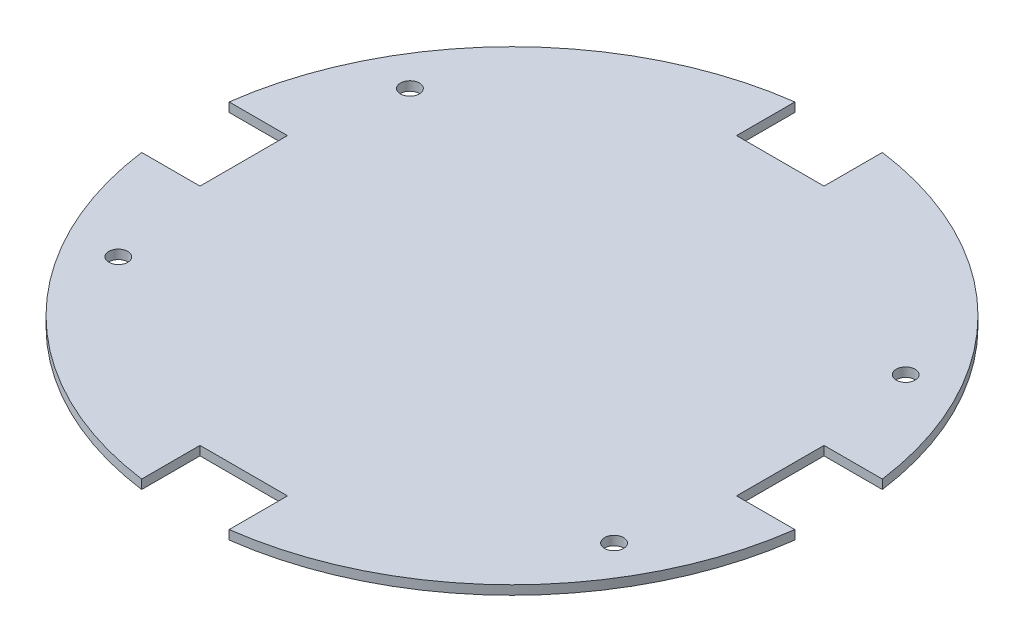
ISO-10303-21;
HEADER;
FILE_DESCRIPTION(('STEP AP214'),'2;1');
FILE_NAME('part.step','',(''),(''),'','','');
FILE_SCHEMA(('AUTOMOTIVE_DESIGN { 1 0 10303 214 1 1 1 1 }'));
ENDSEC;
DATA;
#1=APPLICATION_CONTEXT('core data for automotive mechanical design processes');
#2=APPLICATION_PROTOCOL_DEFINITION('international standard','automotive_design',2000,#1);
#3=PRODUCT_CONTEXT('',#1,'mechanical');
#4=PRODUCT('Part','Part','',(#3));
#5=PRODUCT_RELATED_PRODUCT_CATEGORY('part','',(#4));
#6=PRODUCT_DEFINITION_FORMATION('','',#4);
#7=PRODUCT_DEFINITION_CONTEXT('part definition',#1,'design');
#8=PRODUCT_DEFINITION('design','',#6,#7);
#9=PRODUCT_DEFINITION_SHAPE('','',#8);
#10=(LENGTH_UNIT() NAMED_UNIT(*) SI_UNIT(.MILLI.,.METRE.));
#11=(NAMED_UNIT(*) PLANE_ANGLE_UNIT() SI_UNIT($,.RADIAN.));
#12=(NAMED_UNIT(*) SI_UNIT($,.STERADIAN.) SOLID_ANGLE_UNIT());
#13=UNCERTAINTY_MEASURE_WITH_UNIT(LENGTH_MEASURE(1.E-05),#10,'distance_accuracy_value','');
#14=(GEOMETRIC_REPRESENTATION_CONTEXT(3) GLOBAL_UNCERTAINTY_ASSIGNED_CONTEXT((#13)) GLOBAL_UNIT_ASSIGNED_CONTEXT((#10,
#11,#12)) REPRESENTATION_CONTEXT('',''));
#15=CARTESIAN_POINT('',(0.,0.,0.));
#16=DIRECTION('',(0.,0.,1.));
#17=DIRECTION('',(1.,0.,0.));
#18=AXIS2_PLACEMENT_3D('',#15,#16,#17);
#19=CARTESIAN_POINT('',(0.,1.5875,0.));
#20=DIRECTION('',(0.,1.,0.));
#21=DIRECTION('',(0.,0.,1.));
#22=AXIS2_PLACEMENT_3D('',#19,#20,#21);
#23=PLANE('',#22);
#24=CARTESIAN_POINT('',(43.18,1.5875,25.4));
#25=DIRECTION('',(0.,1.,0.));
#26=DIRECTION('',(0.,0.,1.));
#27=AXIS2_PLACEMENT_3D('',#24,#25,#26);
#28=CIRCLE('',#27,1.651);
#29=CARTESIAN_POINT('',(43.18,1.5875,27.051));
#30=VERTEX_POINT('',#29);
#31=EDGE_CURVE('E343',#30,#30,#28,.T.);
#32=ORIENTED_EDGE('',*,*,#31,.F.);
#33=EDGE_LOOP('',(#32));
#34=FACE_BOUND('',#33,.T.);
#35=CARTESIAN_POINT('',(-43.18,1.5875,-25.4));
#36=DIRECTION('',(0.,1.,0.));
#37=DIRECTION('',(0.,0.,1.));
#38=AXIS2_PLACEMENT_3D('',#35,#36,#37);
#39=CIRCLE('',#38,1.65099999999999);
#40=CARTESIAN_POINT('',(-43.18,1.5875,-23.749));
#41=VERTEX_POINT('',#40);
#42=EDGE_CURVE('E182',#41,#41,#39,.T.);
#43=ORIENTED_EDGE('',*,*,#42,.F.);
#44=EDGE_LOOP('',(#43));
#45=FACE_BOUND('',#44,.T.);
#46=CARTESIAN_POINT('',(0.,1.5875,0.));
#47=DIRECTION('',(0.,1.,0.));
#48=DIRECTION('',(0.,0.,1.));
#49=AXIS2_PLACEMENT_3D('',#46,#47,#48);
#50=CIRCLE('',#49,57.404);
#51=CARTESIAN_POINT('',(-7.62,1.5875,-56.896));
#52=VERTEX_POINT('',#51);
#53=CARTESIAN_POINT('',(-56.896,1.5875,-7.62));
#54=VERTEX_POINT('',#53);
#55=EDGE_CURVE('E209',#52,#54,#50,.T.);
#56=ORIENTED_EDGE('',*,*,#55,.T.);
#57=DIRECTION('',(1.,0.,0.));
#58=VECTOR('',#57,1.);
#59=CARTESIAN_POINT('',(-56.896,1.5875,-7.62));
#60=LINE('',#59,#58);
#61=CARTESIAN_POINT('',(-46.736,1.5875,-7.62));
#62=VERTEX_POINT('',#61);
#63=EDGE_CURVE('E117',#54,#62,#60,.T.);
#64=ORIENTED_EDGE('',*,*,#63,.T.);
#65=DIRECTION('',(0.,0.,1.));
#66=VECTOR('',#65,1.);
#67=CARTESIAN_POINT('',(-46.736,1.5875,-7.62));
#68=LINE('',#67,#66);
#69=CARTESIAN_POINT('',(-46.736,1.5875,7.62));
#70=VERTEX_POINT('',#69);
#71=EDGE_CURVE('E248',#62,#70,#68,.T.);
#72=ORIENTED_EDGE('',*,*,#71,.T.);
#73=DIRECTION('',(-1.,0.,0.));
#74=VECTOR('',#73,1.);
#75=CARTESIAN_POINT('',(-46.736,1.5875,7.62));
#76=LINE('',#75,#74);
#77=CARTESIAN_POINT('',(-56.896,1.5875,7.61999999999998));
#78=VERTEX_POINT('',#77);
#79=EDGE_CURVE('E267',#70,#78,#76,.T.);
#80=ORIENTED_EDGE('',*,*,#79,.T.);
#81=CARTESIAN_POINT('',(0.,1.5875,0.));
#82=DIRECTION('',(0.,1.,0.));
#83=DIRECTION('',(0.,0.,1.));
#84=AXIS2_PLACEMENT_3D('',#81,#82,#83);
#85=CIRCLE('',#84,57.404);
#86=CARTESIAN_POINT('',(-7.62,1.5875,56.896));
#87=VERTEX_POINT('',#86);
#88=EDGE_CURVE('E264',#78,#87,#85,.T.);
#89=ORIENTED_EDGE('',*,*,#88,.T.);
#90=DIRECTION('',(0.,0.,-1.));
#91=VECTOR('',#90,1.);
#92=CARTESIAN_POINT('',(-7.62,1.5875,56.896));
#93=LINE('',#92,#91);
#94=CARTESIAN_POINT('',(-7.62,1.5875,46.736));
#95=VERTEX_POINT('',#94);
#96=EDGE_CURVE('E266',#87,#95,#93,.T.);
#97=ORIENTED_EDGE('',*,*,#96,.T.);
#98=DIRECTION('',(1.,0.,0.));
#99=VECTOR('',#98,1.);
#100=CARTESIAN_POINT('',(-7.62,1.5875,46.736));
#101=LINE('',#100,#99);
#102=CARTESIAN_POINT('',(7.62,1.5875,46.736));
#103=VERTEX_POINT('',#102);
#104=EDGE_CURVE('E269',#95,#103,#101,.T.);
#105=ORIENTED_EDGE('',*,*,#104,.T.);
#106=DIRECTION('',(0.,0.,1.));
#107=VECTOR('',#106,1.);
#108=CARTESIAN_POINT('',(7.62,1.5875,46.736));
#109=LINE('',#108,#107);
#110=CARTESIAN_POINT('',(7.62,1.5875,56.896));
#111=VERTEX_POINT('',#110);
#112=EDGE_CURVE('E275',#103,#111,#109,.T.);
#113=ORIENTED_EDGE('',*,*,#112,.T.);
#114=CARTESIAN_POINT('',(0.,1.5875,0.));
#115=DIRECTION('',(0.,1.,0.));
#116=DIRECTION('',(0.,0.,1.));
#117=AXIS2_PLACEMENT_3D('',#114,#115,#116);
#118=CIRCLE('',#117,57.404);
#119=CARTESIAN_POINT('',(56.896,1.5875,7.62));
#120=VERTEX_POINT('',#119);
#121=EDGE_CURVE('E277',#111,#120,#118,.T.);
#122=ORIENTED_EDGE('',*,*,#121,.T.);
#123=DIRECTION('',(-1.,0.,0.));
#124=VECTOR('',#123,1.);
#125=CARTESIAN_POINT('',(46.736,1.5875,7.62));
#126=LINE('',#125,#124);
#127=CARTESIAN_POINT('',(46.736,1.5875,7.62));
#128=VERTEX_POINT('',#127);
#129=EDGE_CURVE('E279',#120,#128,#126,.T.);
#130=ORIENTED_EDGE('',*,*,#129,.T.);
#131=DIRECTION('',(0.,0.,-1.));
#132=VECTOR('',#131,1.);
#133=CARTESIAN_POINT('',(46.736,1.5875,-7.62));
#134=LINE('',#133,#132);
#135=CARTESIAN_POINT('',(46.736,1.5875,-7.62));
#136=VERTEX_POINT('',#135);
#137=EDGE_CURVE('E281',#128,#136,#134,.T.);
#138=ORIENTED_EDGE('',*,*,#137,.T.);
#139=DIRECTION('',(1.,0.,0.));
#140=VECTOR('',#139,1.);
#141=CARTESIAN_POINT('',(56.896,1.5875,-7.62));
#142=LINE('',#141,#140);
#143=CARTESIAN_POINT('',(56.896,1.5875,-7.62));
#144=VERTEX_POINT('',#143);
#145=EDGE_CURVE('E283',#136,#144,#142,.T.);
#146=ORIENTED_EDGE('',*,*,#145,.T.);
#147=CARTESIAN_POINT('',(0.,1.5875,0.));
#148=DIRECTION('',(0.,1.,0.));
#149=DIRECTION('',(0.,0.,1.));
#150=AXIS2_PLACEMENT_3D('',#147,#148,#149);
#151=CIRCLE('',#150,57.404);
#152=CARTESIAN_POINT('',(7.62,1.5875,-56.896));
#153=VERTEX_POINT('',#152);
#154=EDGE_CURVE('E160',#144,#153,#151,.T.);
#155=ORIENTED_EDGE('',*,*,#154,.T.);
#156=DIRECTION('',(0.,0.,1.));
#157=VECTOR('',#156,1.);
#158=CARTESIAN_POINT('',(7.62,1.5875,-46.736));
#159=LINE('',#158,#157);
#160=CARTESIAN_POINT('',(7.62,1.5875,-46.736));
#161=VERTEX_POINT('',#160);
#162=EDGE_CURVE('E154',#153,#161,#159,.T.);
#163=ORIENTED_EDGE('',*,*,#162,.T.);
#164=DIRECTION('',(-1.,0.,0.));
#165=VECTOR('',#164,1.);
#166=CARTESIAN_POINT('',(-7.62,1.5875,-46.736));
#167=LINE('',#166,#165);
#168=CARTESIAN_POINT('',(-7.62,1.5875,-46.736));
#169=VERTEX_POINT('',#168);
#170=EDGE_CURVE('E158',#161,#169,#167,.T.);
#171=ORIENTED_EDGE('',*,*,#170,.T.);
#172=DIRECTION('',(0.,0.,-1.));
#173=VECTOR('',#172,1.);
#174=CARTESIAN_POINT('',(-7.62,1.5875,-56.896));
#175=LINE('',#174,#173);
#176=EDGE_CURVE('E50',#169,#52,#175,.T.);
#177=ORIENTED_EDGE('',*,*,#176,.T.);
#178=EDGE_LOOP('',(#56,#64,#72,#80,#89,#97,#105,#113,#122,#130,#138,#146,#155,#163,#171,#177));
#179=FACE_BOUND('',#178,.T.);
#180=CARTESIAN_POINT('',(-43.18,1.5875,25.4));
#181=DIRECTION('',(0.,1.,0.));
#182=DIRECTION('',(0.,0.,1.));
#183=AXIS2_PLACEMENT_3D('',#180,#181,#182);
#184=CIRCLE('',#183,1.651);
#185=CARTESIAN_POINT('',(-43.18,1.5875,27.051));
#186=VERTEX_POINT('',#185);
#187=EDGE_CURVE('E349',#186,#186,#184,.T.);
#188=ORIENTED_EDGE('',*,*,#187,.F.);
#189=EDGE_LOOP('',(#188));
#190=FACE_BOUND('',#189,.T.);
#191=CARTESIAN_POINT('',(43.18,1.5875,-25.4));
#192=DIRECTION('',(0.,1.,0.));
#193=DIRECTION('',(0.,0.,1.));
#194=AXIS2_PLACEMENT_3D('',#191,#192,#193);
#195=CIRCLE('',#194,1.651);
#196=CARTESIAN_POINT('',(43.18,1.5875,-23.749));
#197=VERTEX_POINT('',#196);
#198=EDGE_CURVE('E334',#197,#197,#195,.T.);
#199=ORIENTED_EDGE('',*,*,#198,.F.);
#200=EDGE_LOOP('',(#199));
#201=FACE_BOUND('',#200,.T.);
#202=ADVANCED_FACE('F33',(#34,#45,#179,#190,#201),#23,.T.);
#203=CARTESIAN_POINT('',(0.,0.,0.));
#204=DIRECTION('',(0.,1.,0.));
#205=DIRECTION('',(0.,0.,1.));
#206=AXIS2_PLACEMENT_3D('',#203,#204,#205);
#207=PLANE('',#206);
#208=CARTESIAN_POINT('',(0.,0.,0.));
#209=DIRECTION('',(0.,1.,0.));
#210=DIRECTION('',(0.,0.,1.));
#211=AXIS2_PLACEMENT_3D('',#208,#209,#210);
#212=CIRCLE('',#211,57.404);
#213=CARTESIAN_POINT('',(-7.62,0.,-56.896));
#214=VERTEX_POINT('',#213);
#215=CARTESIAN_POINT('',(-56.896,0.,-7.62));
#216=VERTEX_POINT('',#215);
#217=EDGE_CURVE('E178',#214,#216,#212,.T.);
#218=ORIENTED_EDGE('',*,*,#217,.F.);
#219=DIRECTION('',(0.,0.,-1.));
#220=VECTOR('',#219,1.);
#221=CARTESIAN_POINT('',(-7.62,0.,-56.896));
#222=LINE('',#221,#220);
#223=CARTESIAN_POINT('',(-7.62,0.,-46.736));
#224=VERTEX_POINT('',#223);
#225=EDGE_CURVE('E109',#224,#214,#222,.T.);
#226=ORIENTED_EDGE('',*,*,#225,.F.);
#227=DIRECTION('',(-1.,0.,0.));
#228=VECTOR('',#227,1.);
#229=CARTESIAN_POINT('',(-7.62,0.,-46.736));
#230=LINE('',#229,#228);
#231=CARTESIAN_POINT('',(7.62,0.,-46.736));
#232=VERTEX_POINT('',#231);
#233=EDGE_CURVE('E103',#232,#224,#230,.T.);
#234=ORIENTED_EDGE('',*,*,#233,.F.);
#235=DIRECTION('',(0.,0.,1.));
#236=VECTOR('',#235,1.);
#237=CARTESIAN_POINT('',(7.62,0.,-46.736));
#238=LINE('',#237,#236);
#239=CARTESIAN_POINT('',(7.62,0.,-56.896));
#240=VERTEX_POINT('',#239);
#241=EDGE_CURVE('E168',#240,#232,#238,.T.);
#242=ORIENTED_EDGE('',*,*,#241,.F.);
#243=CARTESIAN_POINT('',(0.,0.,0.));
#244=DIRECTION('',(0.,1.,0.));
#245=DIRECTION('',(0.,0.,1.));
#246=AXIS2_PLACEMENT_3D('',#243,#244,#245);
#247=CIRCLE('',#246,57.404);
#248=CARTESIAN_POINT('',(56.896,0.,-7.62));
#249=VERTEX_POINT('',#248);
#250=EDGE_CURVE('E204',#249,#240,#247,.T.);
#251=ORIENTED_EDGE('',*,*,#250,.F.);
#252=DIRECTION('',(1.,0.,0.));
#253=VECTOR('',#252,1.);
#254=CARTESIAN_POINT('',(56.896,0.,-7.62));
#255=LINE('',#254,#253);
#256=CARTESIAN_POINT('',(46.736,0.,-7.62));
#257=VERTEX_POINT('',#256);
#258=EDGE_CURVE('E202',#257,#249,#255,.T.);
#259=ORIENTED_EDGE('',*,*,#258,.F.);
#260=DIRECTION('',(0.,0.,-1.));
#261=VECTOR('',#260,1.);
#262=CARTESIAN_POINT('',(46.736,0.,-7.62));
#263=LINE('',#262,#261);
#264=CARTESIAN_POINT('',(46.736,0.,7.62));
#265=VERTEX_POINT('',#264);
#266=EDGE_CURVE('E200',#265,#257,#263,.T.);
#267=ORIENTED_EDGE('',*,*,#266,.F.);
#268=DIRECTION('',(-1.,0.,0.));
#269=VECTOR('',#268,1.);
#270=CARTESIAN_POINT('',(46.736,0.,7.62));
#271=LINE('',#270,#269);
#272=CARTESIAN_POINT('',(56.896,0.,7.62));
#273=VERTEX_POINT('',#272);
#274=EDGE_CURVE('E198',#273,#265,#271,.T.);
#275=ORIENTED_EDGE('',*,*,#274,.F.);
#276=CARTESIAN_POINT('',(0.,0.,0.));
#277=DIRECTION('',(0.,1.,0.));
#278=DIRECTION('',(0.,0.,1.));
#279=AXIS2_PLACEMENT_3D('',#276,#277,#278);
#280=CIRCLE('',#279,57.404);
#281=CARTESIAN_POINT('',(7.62,0.,56.896));
#282=VERTEX_POINT('',#281);
#283=EDGE_CURVE('E196',#282,#273,#280,.T.);
#284=ORIENTED_EDGE('',*,*,#283,.F.);
#285=DIRECTION('',(0.,0.,1.));
#286=VECTOR('',#285,1.);
#287=CARTESIAN_POINT('',(7.62,0.,46.736));
#288=LINE('',#287,#286);
#289=CARTESIAN_POINT('',(7.62,0.,46.736));
#290=VERTEX_POINT('',#289);
#291=EDGE_CURVE('E194',#290,#282,#288,.T.);
#292=ORIENTED_EDGE('',*,*,#291,.F.);
#293=DIRECTION('',(1.,0.,0.));
#294=VECTOR('',#293,1.);
#295=CARTESIAN_POINT('',(-7.62,0.,46.736));
#296=LINE('',#295,#294);
#297=CARTESIAN_POINT('',(-7.62,0.,46.736));
#298=VERTEX_POINT('',#297);
#299=EDGE_CURVE('E192',#298,#290,#296,.T.);
#300=ORIENTED_EDGE('',*,*,#299,.F.);
#301=DIRECTION('',(0.,0.,-1.));
#302=VECTOR('',#301,1.);
#303=CARTESIAN_POINT('',(-7.62,0.,56.896));
#304=LINE('',#303,#302);
#305=CARTESIAN_POINT('',(-7.62,0.,56.896));
#306=VERTEX_POINT('',#305);
#307=EDGE_CURVE('E190',#306,#298,#304,.T.);
#308=ORIENTED_EDGE('',*,*,#307,.F.);
#309=CARTESIAN_POINT('',(0.,0.,0.));
#310=DIRECTION('',(0.,1.,0.));
#311=DIRECTION('',(0.,0.,1.));
#312=AXIS2_PLACEMENT_3D('',#309,#310,#311);
#313=CIRCLE('',#312,57.404);
#314=CARTESIAN_POINT('',(-56.896,0.,7.61999999999998));
#315=VERTEX_POINT('',#314);
#316=EDGE_CURVE('E188',#315,#306,#313,.T.);
#317=ORIENTED_EDGE('',*,*,#316,.F.);
#318=DIRECTION('',(-1.,0.,0.));
#319=VECTOR('',#318,1.);
#320=CARTESIAN_POINT('',(-46.736,0.,7.62));
#321=LINE('',#320,#319);
#322=CARTESIAN_POINT('',(-46.736,0.,7.62));
#323=VERTEX_POINT('',#322);
#324=EDGE_CURVE('E186',#323,#315,#321,.T.);
#325=ORIENTED_EDGE('',*,*,#324,.F.);
#326=DIRECTION('',(0.,0.,1.));
#327=VECTOR('',#326,1.);
#328=CARTESIAN_POINT('',(-46.736,0.,-7.62));
#329=LINE('',#328,#327);
#330=CARTESIAN_POINT('',(-46.736,0.,-7.62));
#331=VERTEX_POINT('',#330);
#332=EDGE_CURVE('E184',#331,#323,#329,.T.);
#333=ORIENTED_EDGE('',*,*,#332,.F.);
#334=DIRECTION('',(1.,0.,0.));
#335=VECTOR('',#334,1.);
#336=CARTESIAN_POINT('',(-56.896,0.,-7.62));
#337=LINE('',#336,#335);
#338=EDGE_CURVE('E181',#216,#331,#337,.T.);
#339=ORIENTED_EDGE('',*,*,#338,.F.);
#340=EDGE_LOOP('',(#218,#226,#234,#242,#251,#259,#267,#275,#284,#292,#300,#308,#317,#325,#333,#339));
#341=FACE_BOUND('',#340,.T.);
#342=CARTESIAN_POINT('',(-43.18,0.,-25.4));
#343=DIRECTION('',(0.,1.,0.));
#344=DIRECTION('',(0.,0.,1.));
#345=AXIS2_PLACEMENT_3D('',#342,#343,#344);
#346=CIRCLE('',#345,1.65099999999999);
#347=CARTESIAN_POINT('',(-43.18,0.,-23.749));
#348=VERTEX_POINT('',#347);
#349=EDGE_CURVE('E352',#348,#348,#346,.T.);
#350=ORIENTED_EDGE('',*,*,#349,.T.);
#351=EDGE_LOOP('',(#350));
#352=FACE_BOUND('',#351,.T.);
#353=CARTESIAN_POINT('',(-43.18,0.,25.4));
#354=DIRECTION('',(0.,1.,0.));
#355=DIRECTION('',(0.,0.,1.));
#356=AXIS2_PLACEMENT_3D('',#353,#354,#355);
#357=CIRCLE('',#356,1.651);
#358=CARTESIAN_POINT('',(-43.18,0.,27.051));
#359=VERTEX_POINT('',#358);
#360=EDGE_CURVE('E346',#359,#359,#357,.T.);
#361=ORIENTED_EDGE('',*,*,#360,.T.);
#362=EDGE_LOOP('',(#361));
#363=FACE_BOUND('',#362,.T.);
#364=CARTESIAN_POINT('',(43.18,0.,25.4));
#365=DIRECTION('',(0.,1.,0.));
#366=DIRECTION('',(0.,0.,1.));
#367=AXIS2_PLACEMENT_3D('',#364,#365,#366);
#368=CIRCLE('',#367,1.651);
#369=CARTESIAN_POINT('',(43.18,0.,27.051));
#370=VERTEX_POINT('',#369);
#371=EDGE_CURVE('E340',#370,#370,#368,.T.);
#372=ORIENTED_EDGE('',*,*,#371,.T.);
#373=EDGE_LOOP('',(#372));
#374=FACE_BOUND('',#373,.T.);
#375=CARTESIAN_POINT('',(43.18,0.,-25.4));
#376=DIRECTION('',(0.,1.,0.));
#377=DIRECTION('',(0.,0.,1.));
#378=AXIS2_PLACEMENT_3D('',#375,#376,#377);
#379=CIRCLE('',#378,1.651);
#380=CARTESIAN_POINT('',(43.18,0.,-23.749));
#381=VERTEX_POINT('',#380);
#382=EDGE_CURVE('E337',#381,#381,#379,.T.);
#383=ORIENTED_EDGE('',*,*,#382,.T.);
#384=EDGE_LOOP('',(#383));
#385=FACE_BOUND('',#384,.T.);
#386=ADVANCED_FACE('F252',(#341,#352,#363,#374,#385),#207,.F.);
#387=CARTESIAN_POINT('',(0.,1.5875,0.));
#388=DIRECTION('',(0.,-1.,0.));
#389=DIRECTION('',(0.,0.,-1.));
#390=AXIS2_PLACEMENT_3D('',#387,#388,#389);
#391=CYLINDRICAL_SURFACE('',#390,57.404);
#392=ORIENTED_EDGE('',*,*,#217,.T.);
#393=DIRECTION('',(0.,-1.,0.));
#394=VECTOR('',#393,1.);
#395=CARTESIAN_POINT('',(-56.896,1.5875,-7.62));
#396=LINE('',#395,#394);
#397=EDGE_CURVE('E11',#54,#216,#396,.T.);
#398=ORIENTED_EDGE('',*,*,#397,.F.);
#399=ORIENTED_EDGE('',*,*,#55,.F.);
#400=DIRECTION('',(0.,-1.,0.));
#401=VECTOR('',#400,1.);
#402=CARTESIAN_POINT('',(-7.62,1.5875,-56.896));
#403=LINE('',#402,#401);
#404=EDGE_CURVE('E174',#52,#214,#403,.T.);
#405=ORIENTED_EDGE('',*,*,#404,.T.);
#406=EDGE_LOOP('',(#392,#398,#399,#405));
#407=FACE_BOUND('',#406,.T.);
#408=ADVANCED_FACE('F35',(#407),#391,.T.);
#409=CARTESIAN_POINT('',(-56.896,1.5875,-7.62));
#410=DIRECTION('',(0.,0.,-1.));
#411=DIRECTION('',(-1.,0.,0.));
#412=AXIS2_PLACEMENT_3D('',#409,#410,#411);
#413=PLANE('',#412);
#414=ORIENTED_EDGE('',*,*,#338,.T.);
#415=DIRECTION('',(0.,-1.,0.));
#416=VECTOR('',#415,1.);
#417=CARTESIAN_POINT('',(-46.736,1.5875,-7.62));
#418=LINE('',#417,#416);
#419=EDGE_CURVE('E42',#62,#331,#418,.T.);
#420=ORIENTED_EDGE('',*,*,#419,.F.);
#421=ORIENTED_EDGE('',*,*,#63,.F.);
#422=ORIENTED_EDGE('',*,*,#397,.T.);
#423=EDGE_LOOP('',(#414,#420,#421,#422));
#424=FACE_BOUND('',#423,.T.);
#425=ADVANCED_FACE('F502',(#424),#413,.F.);
#426=CARTESIAN_POINT('',(-46.736,1.5875,-7.62));
#427=DIRECTION('',(1.,0.,0.));
#428=DIRECTION('',(0.,0.,-1.));
#429=AXIS2_PLACEMENT_3D('',#426,#427,#428);
#430=PLANE('',#429);
#431=ORIENTED_EDGE('',*,*,#332,.T.);
#432=DIRECTION('',(0.,-1.,0.));
#433=VECTOR('',#432,1.);
#434=CARTESIAN_POINT('',(-46.736,1.5875,7.62));
#435=LINE('',#434,#433);
#436=EDGE_CURVE('E240',#70,#323,#435,.T.);
#437=ORIENTED_EDGE('',*,*,#436,.F.);
#438=ORIENTED_EDGE('',*,*,#71,.F.);
#439=ORIENTED_EDGE('',*,*,#419,.T.);
#440=EDGE_LOOP('',(#431,#437,#438,#439));
#441=FACE_BOUND('',#440,.T.);
#442=ADVANCED_FACE('F246',(#441),#430,.F.);
#443=CARTESIAN_POINT('',(-46.736,1.5875,7.62));
#444=DIRECTION('',(0.,0.,1.));
#445=DIRECTION('',(1.,0.,0.));
#446=AXIS2_PLACEMENT_3D('',#443,#444,#445);
#447=PLANE('',#446);
#448=ORIENTED_EDGE('',*,*,#324,.T.);
#449=DIRECTION('',(0.,-1.,0.));
#450=VECTOR('',#449,1.);
#451=CARTESIAN_POINT('',(-56.896,1.5875,7.61999999999998));
#452=LINE('',#451,#450);
#453=EDGE_CURVE('E237',#78,#315,#452,.T.);
#454=ORIENTED_EDGE('',*,*,#453,.F.);
#455=ORIENTED_EDGE('',*,*,#79,.F.);
#456=ORIENTED_EDGE('',*,*,#436,.T.);
#457=EDGE_LOOP('',(#448,#454,#455,#456));
#458=FACE_BOUND('',#457,.T.);
#459=ADVANCED_FACE('F258',(#458),#447,.F.);
#460=CARTESIAN_POINT('',(0.,1.5875,0.));
#461=DIRECTION('',(0.,-1.,0.));
#462=DIRECTION('',(0.,0.,-1.));
#463=AXIS2_PLACEMENT_3D('',#460,#461,#462);
#464=CYLINDRICAL_SURFACE('',#463,57.404);
#465=ORIENTED_EDGE('',*,*,#316,.T.);
#466=DIRECTION('',(0.,-1.,0.));
#467=VECTOR('',#466,1.);
#468=CARTESIAN_POINT('',(-7.62,1.5875,56.896));
#469=LINE('',#468,#467);
#470=EDGE_CURVE('E234',#87,#306,#469,.T.);
#471=ORIENTED_EDGE('',*,*,#470,.F.);
#472=ORIENTED_EDGE('',*,*,#88,.F.);
#473=ORIENTED_EDGE('',*,*,#453,.T.);
#474=EDGE_LOOP('',(#465,#471,#472,#473));
#475=FACE_BOUND('',#474,.T.);
#476=ADVANCED_FACE('F262',(#475),#464,.T.);
#477=CARTESIAN_POINT('',(-7.62,1.5875,56.896));
#478=DIRECTION('',(-1.,0.,0.));
#479=DIRECTION('',(0.,0.,1.));
#480=AXIS2_PLACEMENT_3D('',#477,#478,#479);
#481=PLANE('',#480);
#482=ORIENTED_EDGE('',*,*,#307,.T.);
#483=DIRECTION('',(0.,-1.,0.));
#484=VECTOR('',#483,1.);
#485=CARTESIAN_POINT('',(-7.62,1.5875,46.736));
#486=LINE('',#485,#484);
#487=EDGE_CURVE('E231',#95,#298,#486,.T.);
#488=ORIENTED_EDGE('',*,*,#487,.F.);
#489=ORIENTED_EDGE('',*,*,#96,.F.);
#490=ORIENTED_EDGE('',*,*,#470,.T.);
#491=EDGE_LOOP('',(#482,#488,#489,#490));
#492=FACE_BOUND('',#491,.T.);
#493=ADVANCED_FACE('F467',(#492),#481,.F.);
#494=CARTESIAN_POINT('',(-7.62,1.5875,46.736));
#495=DIRECTION('',(0.,0.,-1.));
#496=DIRECTION('',(-1.,0.,0.));
#497=AXIS2_PLACEMENT_3D('',#494,#495,#496);
#498=PLANE('',#497);
#499=ORIENTED_EDGE('',*,*,#299,.T.);
#500=DIRECTION('',(0.,-1.,0.));
#501=VECTOR('',#500,1.);
#502=CARTESIAN_POINT('',(7.62,1.5875,46.736));
#503=LINE('',#502,#501);
#504=EDGE_CURVE('E228',#103,#290,#503,.T.);
#505=ORIENTED_EDGE('',*,*,#504,.F.);
#506=ORIENTED_EDGE('',*,*,#104,.F.);
#507=ORIENTED_EDGE('',*,*,#487,.T.);
#508=EDGE_LOOP('',(#499,#505,#506,#507));
#509=FACE_BOUND('',#508,.T.);
#510=ADVANCED_FACE('F457',(#509),#498,.F.);
#511=CARTESIAN_POINT('',(7.62,1.5875,46.736));
#512=DIRECTION('',(1.,0.,0.));
#513=DIRECTION('',(0.,0.,-1.));
#514=AXIS2_PLACEMENT_3D('',#511,#512,#513);
#515=PLANE('',#514);
#516=ORIENTED_EDGE('',*,*,#291,.T.);
#517=DIRECTION('',(0.,-1.,0.));
#518=VECTOR('',#517,1.);
#519=CARTESIAN_POINT('',(7.62,1.5875,56.896));
#520=LINE('',#519,#518);
#521=EDGE_CURVE('E225',#111,#282,#520,.T.);
#522=ORIENTED_EDGE('',*,*,#521,.F.);
#523=ORIENTED_EDGE('',*,*,#112,.F.);
#524=ORIENTED_EDGE('',*,*,#504,.T.);
#525=EDGE_LOOP('',(#516,#522,#523,#524));
#526=FACE_BOUND('',#525,.T.);
#527=ADVANCED_FACE('F447',(#526),#515,.F.);
#528=CARTESIAN_POINT('',(0.,1.5875,0.));
#529=DIRECTION('',(0.,-1.,0.));
#530=DIRECTION('',(0.,0.,-1.));
#531=AXIS2_PLACEMENT_3D('',#528,#529,#530);
#532=CYLINDRICAL_SURFACE('',#531,57.404);
#533=ORIENTED_EDGE('',*,*,#283,.T.);
#534=DIRECTION('',(0.,-1.,0.));
#535=VECTOR('',#534,1.);
#536=CARTESIAN_POINT('',(56.896,1.5875,7.62));
#537=LINE('',#536,#535);
#538=EDGE_CURVE('E222',#120,#273,#537,.T.);
#539=ORIENTED_EDGE('',*,*,#538,.F.);
#540=ORIENTED_EDGE('',*,*,#121,.F.);
#541=ORIENTED_EDGE('',*,*,#521,.T.);
#542=EDGE_LOOP('',(#533,#539,#540,#541));
#543=FACE_BOUND('',#542,.T.);
#544=ADVANCED_FACE('F437',(#543),#532,.T.);
#545=CARTESIAN_POINT('',(46.736,1.5875,7.62));
#546=DIRECTION('',(0.,0.,1.));
#547=DIRECTION('',(1.,0.,0.));
#548=AXIS2_PLACEMENT_3D('',#545,#546,#547);
#549=PLANE('',#548);
#550=ORIENTED_EDGE('',*,*,#274,.T.);
#551=DIRECTION('',(0.,-1.,0.));
#552=VECTOR('',#551,1.);
#553=CARTESIAN_POINT('',(46.736,1.5875,7.62));
#554=LINE('',#553,#552);
#555=EDGE_CURVE('E219',#128,#265,#554,.T.);
#556=ORIENTED_EDGE('',*,*,#555,.F.);
#557=ORIENTED_EDGE('',*,*,#129,.F.);
#558=ORIENTED_EDGE('',*,*,#538,.T.);
#559=EDGE_LOOP('',(#550,#556,#557,#558));
#560=FACE_BOUND('',#559,.T.);
#561=ADVANCED_FACE('F427',(#560),#549,.F.);
#562=CARTESIAN_POINT('',(46.736,1.5875,-7.62));
#563=DIRECTION('',(-1.,0.,0.));
#564=DIRECTION('',(0.,0.,1.));
#565=AXIS2_PLACEMENT_3D('',#562,#563,#564);
#566=PLANE('',#565);
#567=ORIENTED_EDGE('',*,*,#266,.T.);
#568=DIRECTION('',(0.,-1.,0.));
#569=VECTOR('',#568,1.);
#570=CARTESIAN_POINT('',(46.736,1.5875,-7.62));
#571=LINE('',#570,#569);
#572=EDGE_CURVE('E216',#136,#257,#571,.T.);
#573=ORIENTED_EDGE('',*,*,#572,.F.);
#574=ORIENTED_EDGE('',*,*,#137,.F.);
#575=ORIENTED_EDGE('',*,*,#555,.T.);
#576=EDGE_LOOP('',(#567,#573,#574,#575));
#577=FACE_BOUND('',#576,.T.);
#578=ADVANCED_FACE('F418',(#577),#566,.F.);
#579=CARTESIAN_POINT('',(56.896,1.5875,-7.62));
#580=DIRECTION('',(0.,0.,-1.));
#581=DIRECTION('',(-1.,0.,0.));
#582=AXIS2_PLACEMENT_3D('',#579,#580,#581);
#583=PLANE('',#582);
#584=ORIENTED_EDGE('',*,*,#258,.T.);
#585=DIRECTION('',(0.,-1.,0.));
#586=VECTOR('',#585,1.);
#587=CARTESIAN_POINT('',(56.896,1.5875,-7.62));
#588=LINE('',#587,#586);
#589=EDGE_CURVE('E213',#144,#249,#588,.T.);
#590=ORIENTED_EDGE('',*,*,#589,.F.);
#591=ORIENTED_EDGE('',*,*,#145,.F.);
#592=ORIENTED_EDGE('',*,*,#572,.T.);
#593=EDGE_LOOP('',(#584,#590,#591,#592));
#594=FACE_BOUND('',#593,.T.);
#595=ADVANCED_FACE('F289',(#594),#583,.F.);
#596=CARTESIAN_POINT('',(0.,1.5875,0.));
#597=DIRECTION('',(0.,-1.,0.));
#598=DIRECTION('',(0.,0.,-1.));
#599=AXIS2_PLACEMENT_3D('',#596,#597,#598);
#600=CYLINDRICAL_SURFACE('',#599,57.404);
#601=ORIENTED_EDGE('',*,*,#250,.T.);
#602=DIRECTION('',(0.,-1.,0.));
#603=VECTOR('',#602,1.);
#604=CARTESIAN_POINT('',(7.62,1.5875,-56.896));
#605=LINE('',#604,#603);
#606=EDGE_CURVE('E169',#153,#240,#605,.T.);
#607=ORIENTED_EDGE('',*,*,#606,.F.);
#608=ORIENTED_EDGE('',*,*,#154,.F.);
#609=ORIENTED_EDGE('',*,*,#589,.T.);
#610=EDGE_LOOP('',(#601,#607,#608,#609));
#611=FACE_BOUND('',#610,.T.);
#612=ADVANCED_FACE('F293',(#611),#600,.T.);
#613=CARTESIAN_POINT('',(7.62,1.5875,-46.736));
#614=DIRECTION('',(1.,0.,0.));
#615=DIRECTION('',(0.,0.,-1.));
#616=AXIS2_PLACEMENT_3D('',#613,#614,#615);
#617=PLANE('',#616);
#618=ORIENTED_EDGE('',*,*,#241,.T.);
#619=DIRECTION('',(0.,-1.,0.));
#620=VECTOR('',#619,1.);
#621=CARTESIAN_POINT('',(7.62,1.5875,-46.736));
#622=LINE('',#621,#620);
#623=EDGE_CURVE('E165',#161,#232,#622,.T.);
#624=ORIENTED_EDGE('',*,*,#623,.F.);
#625=ORIENTED_EDGE('',*,*,#162,.F.);
#626=ORIENTED_EDGE('',*,*,#606,.T.);
#627=EDGE_LOOP('',(#618,#624,#625,#626));
#628=FACE_BOUND('',#627,.T.);
#629=ADVANCED_FACE('F166',(#628),#617,.F.);
#630=CARTESIAN_POINT('',(-7.62,1.5875,-46.736));
#631=DIRECTION('',(0.,0.,1.));
#632=DIRECTION('',(1.,0.,0.));
#633=AXIS2_PLACEMENT_3D('',#630,#631,#632);
#634=PLANE('',#633);
#635=ORIENTED_EDGE('',*,*,#233,.T.);
#636=DIRECTION('',(0.,-1.,0.));
#637=VECTOR('',#636,1.);
#638=CARTESIAN_POINT('',(-7.62,1.5875,-46.736));
#639=LINE('',#638,#637);
#640=EDGE_CURVE('E170',#169,#224,#639,.T.);
#641=ORIENTED_EDGE('',*,*,#640,.F.);
#642=ORIENTED_EDGE('',*,*,#170,.F.);
#643=ORIENTED_EDGE('',*,*,#623,.T.);
#644=EDGE_LOOP('',(#635,#641,#642,#643));
#645=FACE_BOUND('',#644,.T.);
#646=ADVANCED_FACE('F172',(#645),#634,.F.);
#647=CARTESIAN_POINT('',(-7.62,1.5875,-56.896));
#648=DIRECTION('',(-1.,0.,0.));
#649=DIRECTION('',(0.,0.,1.));
#650=AXIS2_PLACEMENT_3D('',#647,#648,#649);
#651=PLANE('',#650);
#652=ORIENTED_EDGE('',*,*,#225,.T.);
#653=ORIENTED_EDGE('',*,*,#404,.F.);
#654=ORIENTED_EDGE('',*,*,#176,.F.);
#655=ORIENTED_EDGE('',*,*,#640,.T.);
#656=EDGE_LOOP('',(#652,#653,#654,#655));
#657=FACE_BOUND('',#656,.T.);
#658=ADVANCED_FACE('F297',(#657),#651,.F.);
#659=CARTESIAN_POINT('',(-43.18,1.5875,-25.4));
#660=DIRECTION('',(0.,-1.,0.));
#661=DIRECTION('',(0.,0.,-1.));
#662=AXIS2_PLACEMENT_3D('',#659,#660,#661);
#663=CYLINDRICAL_SURFACE('',#662,1.65099999999999);
#664=ORIENTED_EDGE('',*,*,#42,.T.);
#665=EDGE_LOOP('',(#664));
#666=FACE_BOUND('',#665,.T.);
#667=ORIENTED_EDGE('',*,*,#349,.F.);
#668=EDGE_LOOP('',(#667));
#669=FACE_BOUND('',#668,.T.);
#670=ADVANCED_FACE('F299',(#666,#669),#663,.F.);
#671=CARTESIAN_POINT('',(-43.18,1.5875,25.4));
#672=DIRECTION('',(0.,-1.,0.));
#673=DIRECTION('',(0.,0.,-1.));
#674=AXIS2_PLACEMENT_3D('',#671,#672,#673);
#675=CYLINDRICAL_SURFACE('',#674,1.651);
#676=ORIENTED_EDGE('',*,*,#187,.T.);
#677=EDGE_LOOP('',(#676));
#678=FACE_BOUND('',#677,.T.);
#679=ORIENTED_EDGE('',*,*,#360,.F.);
#680=EDGE_LOOP('',(#679));
#681=FACE_BOUND('',#680,.T.);
#682=ADVANCED_FACE('F305',(#678,#681),#675,.F.);
#683=CARTESIAN_POINT('',(43.18,1.5875,25.4));
#684=DIRECTION('',(0.,-1.,0.));
#685=DIRECTION('',(0.,0.,-1.));
#686=AXIS2_PLACEMENT_3D('',#683,#684,#685);
#687=CYLINDRICAL_SURFACE('',#686,1.651);
#688=ORIENTED_EDGE('',*,*,#31,.T.);
#689=EDGE_LOOP('',(#688));
#690=FACE_BOUND('',#689,.T.);
#691=ORIENTED_EDGE('',*,*,#371,.F.);
#692=EDGE_LOOP('',(#691));
#693=FACE_BOUND('',#692,.T.);
#694=ADVANCED_FACE('F321',(#690,#693),#687,.F.);
#695=CARTESIAN_POINT('',(43.18,1.5875,-25.4));
#696=DIRECTION('',(0.,-1.,0.));
#697=DIRECTION('',(0.,0.,-1.));
#698=AXIS2_PLACEMENT_3D('',#695,#696,#697);
#699=CYLINDRICAL_SURFACE('',#698,1.651);
#700=ORIENTED_EDGE('',*,*,#198,.T.);
#701=EDGE_LOOP('',(#700));
#702=FACE_BOUND('',#701,.T.);
#703=ORIENTED_EDGE('',*,*,#382,.F.);
#704=EDGE_LOOP('',(#703));
#705=FACE_BOUND('',#704,.T.);
#706=ADVANCED_FACE('F325',(#702,#705),#699,.F.);
#707=CLOSED_SHELL('',(#202,#386,#408,#425,#442,#459,#476,#493,#510,#527,#544,#561,#578,#595,
#612,#629,#646,#658,#670,#682,#694,#706));
#708=MANIFOLD_SOLID_BREP('B2',#707);
#709=ADVANCED_BREP_SHAPE_REPRESENTATION('',(#18,#708),#14);
#710=SHAPE_DEFINITION_REPRESENTATION(#9,#709);
ENDSEC;
END-ISO-10303-21;
